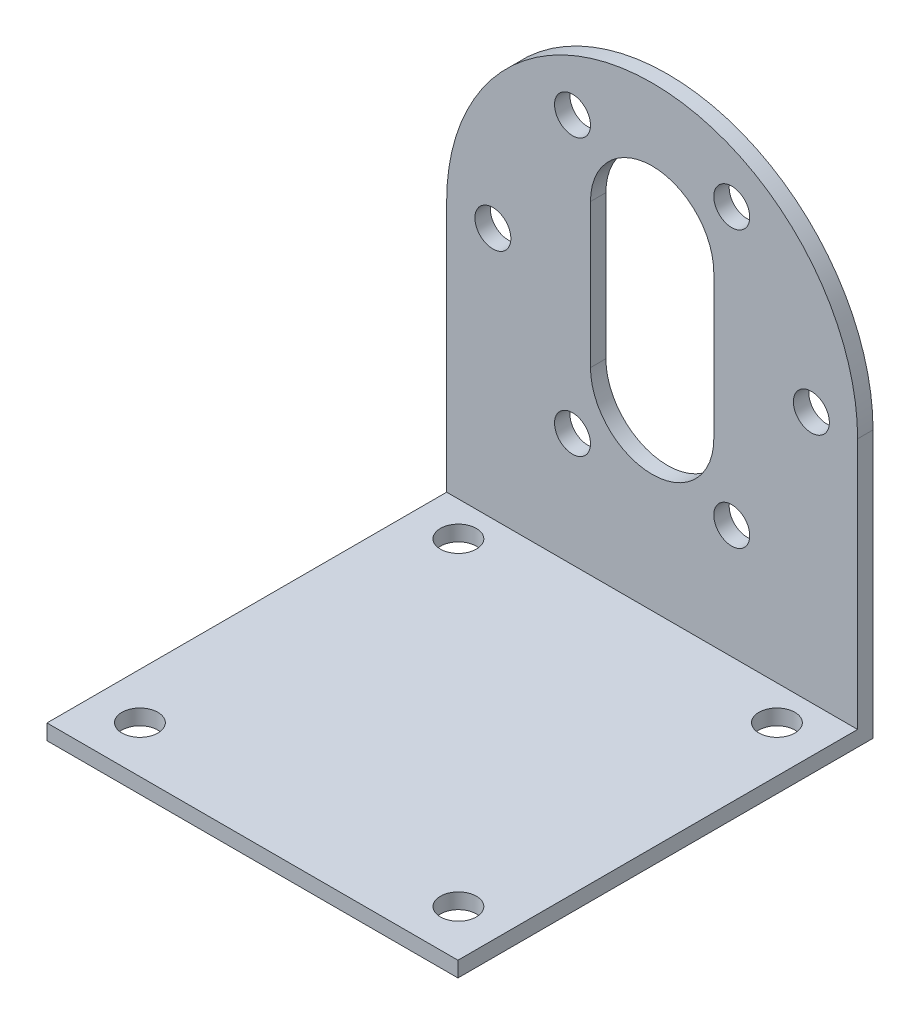
ISO-10303-21;
HEADER;
FILE_DESCRIPTION(('STEP AP214'),'2;1');
FILE_NAME('part.step','',(''),(''),'','','');
FILE_SCHEMA(('AUTOMOTIVE_DESIGN { 1 0 10303 214 1 1 1 1 }'));
ENDSEC;
DATA;
#1=APPLICATION_CONTEXT('core data for automotive mechanical design processes');
#2=APPLICATION_PROTOCOL_DEFINITION('international standard','automotive_design',2000,#1);
#3=PRODUCT_CONTEXT('',#1,'mechanical');
#4=PRODUCT('Part','Part','',(#3));
#5=PRODUCT_RELATED_PRODUCT_CATEGORY('part','',(#4));
#6=PRODUCT_DEFINITION_FORMATION('','',#4);
#7=PRODUCT_DEFINITION_CONTEXT('part definition',#1,'design');
#8=PRODUCT_DEFINITION('design','',#6,#7);
#9=PRODUCT_DEFINITION_SHAPE('','',#8);
#10=(LENGTH_UNIT() NAMED_UNIT(*) SI_UNIT(.MILLI.,.METRE.));
#11=(NAMED_UNIT(*) PLANE_ANGLE_UNIT() SI_UNIT($,.RADIAN.));
#12=(NAMED_UNIT(*) SI_UNIT($,.STERADIAN.) SOLID_ANGLE_UNIT());
#13=UNCERTAINTY_MEASURE_WITH_UNIT(LENGTH_MEASURE(1.E-05),#10,'distance_accuracy_value','');
#14=(GEOMETRIC_REPRESENTATION_CONTEXT(3) GLOBAL_UNCERTAINTY_ASSIGNED_CONTEXT((#13)) GLOBAL_UNIT_ASSIGNED_CONTEXT((#10,
#11,#12)) REPRESENTATION_CONTEXT('',''));
#15=CARTESIAN_POINT('',(0.,0.,0.));
#16=DIRECTION('',(0.,0.,1.));
#17=DIRECTION('',(1.,0.,0.));
#18=AXIS2_PLACEMENT_3D('',#15,#16,#17);
#19=CARTESIAN_POINT('',(20.,33.,1.5));
#20=DIRECTION('',(0.,0.,-1.));
#21=DIRECTION('',(-1.,0.,0.));
#22=AXIS2_PLACEMENT_3D('',#19,#20,#21);
#23=CYLINDRICAL_SURFACE('',#22,6.00000000000001);
#24=CARTESIAN_POINT('',(20.,33.,0.));
#25=DIRECTION('',(0.,0.,1.));
#26=DIRECTION('',(1.,0.,0.));
#27=AXIS2_PLACEMENT_3D('',#24,#25,#26);
#28=CIRCLE('',#27,6.00000000000001);
#29=CARTESIAN_POINT('',(26.,33.,0.));
#30=VERTEX_POINT('',#29);
#31=CARTESIAN_POINT('',(14.,33.,0.));
#32=VERTEX_POINT('',#31);
#33=EDGE_CURVE('E192',#30,#32,#28,.T.);
#34=ORIENTED_EDGE('',*,*,#33,.F.);
#35=DIRECTION('',(0.,0.,-1.));
#36=VECTOR('',#35,1.);
#37=CARTESIAN_POINT('',(26.,33.,1.5));
#38=LINE('',#37,#36);
#39=CARTESIAN_POINT('',(26.,33.,1.5));
#40=VERTEX_POINT('',#39);
#41=EDGE_CURVE('E11',#40,#30,#38,.T.);
#42=ORIENTED_EDGE('',*,*,#41,.F.);
#43=CARTESIAN_POINT('',(20.,33.,1.5));
#44=DIRECTION('',(0.,0.,1.));
#45=DIRECTION('',(1.,0.,0.));
#46=AXIS2_PLACEMENT_3D('',#43,#44,#45);
#47=CIRCLE('',#46,6.00000000000001);
#48=CARTESIAN_POINT('',(14.,33.,1.5));
#49=VERTEX_POINT('',#48);
#50=EDGE_CURVE('E154',#40,#49,#47,.T.);
#51=ORIENTED_EDGE('',*,*,#50,.T.);
#52=DIRECTION('',(0.,0.,-1.));
#53=VECTOR('',#52,1.);
#54=CARTESIAN_POINT('',(14.,33.,1.5));
#55=LINE('',#54,#53);
#56=EDGE_CURVE('E215',#49,#32,#55,.T.);
#57=ORIENTED_EDGE('',*,*,#56,.T.);
#58=EDGE_LOOP('',(#34,#42,#51,#57));
#59=FACE_BOUND('',#58,.T.);
#60=ADVANCED_FACE('F34',(#59),#23,.F.);
#61=CARTESIAN_POINT('',(26.,0.,1.5));
#62=DIRECTION('',(-1.,0.,0.));
#63=DIRECTION('',(0.,0.,1.));
#64=AXIS2_PLACEMENT_3D('',#61,#62,#63);
#65=PLANE('',#64);
#66=DIRECTION('',(0.,1.,0.));
#67=VECTOR('',#66,1.);
#68=CARTESIAN_POINT('',(26.,0.,0.));
#69=LINE('',#68,#67);
#70=CARTESIAN_POINT('',(26.,19.,0.));
#71=VERTEX_POINT('',#70);
#72=EDGE_CURVE('E195',#71,#30,#69,.T.);
#73=ORIENTED_EDGE('',*,*,#72,.F.);
#74=DIRECTION('',(0.,0.,-1.));
#75=VECTOR('',#74,1.);
#76=CARTESIAN_POINT('',(26.,19.,1.5));
#77=LINE('',#76,#75);
#78=CARTESIAN_POINT('',(26.,19.,1.5));
#79=VERTEX_POINT('',#78);
#80=EDGE_CURVE('E43',#79,#71,#77,.T.);
#81=ORIENTED_EDGE('',*,*,#80,.F.);
#82=DIRECTION('',(0.,1.,0.));
#83=VECTOR('',#82,1.);
#84=CARTESIAN_POINT('',(26.,0.,1.5));
#85=LINE('',#84,#83);
#86=EDGE_CURVE('E157',#79,#40,#85,.T.);
#87=ORIENTED_EDGE('',*,*,#86,.T.);
#88=ORIENTED_EDGE('',*,*,#41,.T.);
#89=EDGE_LOOP('',(#73,#81,#87,#88));
#90=FACE_BOUND('',#89,.T.);
#91=ADVANCED_FACE('F299',(#90),#65,.T.);
#92=CARTESIAN_POINT('',(20.,19.,1.5));
#93=DIRECTION('',(0.,0.,-1.));
#94=DIRECTION('',(-1.,0.,0.));
#95=AXIS2_PLACEMENT_3D('',#92,#93,#94);
#96=CYLINDRICAL_SURFACE('',#95,6.00000000000001);
#97=CARTESIAN_POINT('',(20.,19.,0.));
#98=DIRECTION('',(0.,0.,1.));
#99=DIRECTION('',(1.,0.,0.));
#100=AXIS2_PLACEMENT_3D('',#97,#98,#99);
#101=CIRCLE('',#100,6.00000000000001);
#102=CARTESIAN_POINT('',(14.,19.,0.));
#103=VERTEX_POINT('',#102);
#104=EDGE_CURVE('E198',#103,#71,#101,.T.);
#105=ORIENTED_EDGE('',*,*,#104,.F.);
#106=DIRECTION('',(0.,0.,-1.));
#107=VECTOR('',#106,1.);
#108=CARTESIAN_POINT('',(14.,19.,1.5));
#109=LINE('',#108,#107);
#110=CARTESIAN_POINT('',(14.,19.,1.5));
#111=VERTEX_POINT('',#110);
#112=EDGE_CURVE('E217',#111,#103,#109,.T.);
#113=ORIENTED_EDGE('',*,*,#112,.F.);
#114=CARTESIAN_POINT('',(20.,19.,1.5));
#115=DIRECTION('',(0.,0.,1.));
#116=DIRECTION('',(1.,0.,0.));
#117=AXIS2_PLACEMENT_3D('',#114,#115,#116);
#118=CIRCLE('',#117,6.00000000000001);
#119=EDGE_CURVE('E160',#111,#79,#118,.T.);
#120=ORIENTED_EDGE('',*,*,#119,.T.);
#121=ORIENTED_EDGE('',*,*,#80,.T.);
#122=EDGE_LOOP('',(#105,#113,#120,#121));
#123=FACE_BOUND('',#122,.T.);
#124=ADVANCED_FACE('F305',(#123),#96,.F.);
#125=CARTESIAN_POINT('',(40.,0.,1.5));
#126=DIRECTION('',(-1.,0.,0.));
#127=DIRECTION('',(0.,0.,1.));
#128=AXIS2_PLACEMENT_3D('',#125,#126,#127);
#129=PLANE('',#128);
#130=DIRECTION('',(0.,1.,0.));
#131=VECTOR('',#130,1.);
#132=CARTESIAN_POINT('',(40.,0.,1.5));
#133=LINE('',#132,#131);
#134=CARTESIAN_POINT('',(40.,1.5,1.5));
#135=VERTEX_POINT('',#134);
#136=CARTESIAN_POINT('',(40.,26.,1.5));
#137=VERTEX_POINT('',#136);
#138=EDGE_CURVE('E117',#135,#137,#133,.T.);
#139=ORIENTED_EDGE('',*,*,#138,.F.);
#140=DIRECTION('',(0.,0.,1.));
#141=VECTOR('',#140,1.);
#142=CARTESIAN_POINT('',(40.,1.5,0.));
#143=LINE('',#142,#141);
#144=CARTESIAN_POINT('',(40.,1.5,40.4));
#145=VERTEX_POINT('',#144);
#146=EDGE_CURVE('E110',#135,#145,#143,.T.);
#147=ORIENTED_EDGE('',*,*,#146,.T.);
#148=DIRECTION('',(0.,-1.,0.));
#149=VECTOR('',#148,1.);
#150=CARTESIAN_POINT('',(40.,1.5,40.4));
#151=LINE('',#150,#149);
#152=CARTESIAN_POINT('',(40.,0.,40.4));
#153=VERTEX_POINT('',#152);
#154=EDGE_CURVE('E114',#145,#153,#151,.T.);
#155=ORIENTED_EDGE('',*,*,#154,.T.);
#156=DIRECTION('',(0.,0.,-1.));
#157=VECTOR('',#156,1.);
#158=CARTESIAN_POINT('',(40.,0.,1.5));
#159=LINE('',#158,#157);
#160=CARTESIAN_POINT('',(40.,0.,0.));
#161=VERTEX_POINT('',#160);
#162=EDGE_CURVE('E177',#153,#161,#159,.T.);
#163=ORIENTED_EDGE('',*,*,#162,.T.);
#164=DIRECTION('',(0.,1.,0.));
#165=VECTOR('',#164,1.);
#166=CARTESIAN_POINT('',(40.,0.,0.));
#167=LINE('',#166,#165);
#168=CARTESIAN_POINT('',(40.,26.,0.));
#169=VERTEX_POINT('',#168);
#170=EDGE_CURVE('E180',#161,#169,#167,.T.);
#171=ORIENTED_EDGE('',*,*,#170,.T.);
#172=DIRECTION('',(0.,0.,-1.));
#173=VECTOR('',#172,1.);
#174=CARTESIAN_POINT('',(40.,26.,1.5));
#175=LINE('',#174,#173);
#176=EDGE_CURVE('E38',#137,#169,#175,.T.);
#177=ORIENTED_EDGE('',*,*,#176,.F.);
#178=EDGE_LOOP('',(#139,#147,#155,#163,#171,#177));
#179=FACE_BOUND('',#178,.T.);
#180=ADVANCED_FACE('F112',(#179),#129,.F.);
#181=CARTESIAN_POINT('',(20.,26.,1.5));
#182=DIRECTION('',(0.,0.,-1.));
#183=DIRECTION('',(-1.,0.,0.));
#184=AXIS2_PLACEMENT_3D('',#181,#182,#183);
#185=CYLINDRICAL_SURFACE('',#184,20.);
#186=CARTESIAN_POINT('',(20.,26.,0.));
#187=DIRECTION('',(0.,0.,1.));
#188=DIRECTION('',(1.,0.,0.));
#189=AXIS2_PLACEMENT_3D('',#186,#187,#188);
#190=CIRCLE('',#189,20.);
#191=CARTESIAN_POINT('',(0.,26.,0.));
#192=VERTEX_POINT('',#191);
#193=EDGE_CURVE('E182',#192,#169,#190,.F.);
#194=ORIENTED_EDGE('',*,*,#193,.F.);
#195=DIRECTION('',(0.,0.,-1.));
#196=VECTOR('',#195,1.);
#197=CARTESIAN_POINT('',(0.,26.,1.5));
#198=LINE('',#197,#196);
#199=CARTESIAN_POINT('',(0.,26.,1.5));
#200=VERTEX_POINT('',#199);
#201=EDGE_CURVE('E222',#200,#192,#198,.T.);
#202=ORIENTED_EDGE('',*,*,#201,.F.);
#203=CARTESIAN_POINT('',(20.,26.,1.5));
#204=DIRECTION('',(0.,0.,1.));
#205=DIRECTION('',(1.,0.,0.));
#206=AXIS2_PLACEMENT_3D('',#203,#204,#205);
#207=CIRCLE('',#206,20.);
#208=EDGE_CURVE('E147',#200,#137,#207,.F.);
#209=ORIENTED_EDGE('',*,*,#208,.T.);
#210=ORIENTED_EDGE('',*,*,#176,.T.);
#211=EDGE_LOOP('',(#194,#202,#209,#210));
#212=FACE_BOUND('',#211,.T.);
#213=ADVANCED_FACE('F230',(#212),#185,.T.);
#214=CARTESIAN_POINT('',(0.,0.,1.5));
#215=DIRECTION('',(-1.,0.,0.));
#216=DIRECTION('',(0.,0.,1.));
#217=AXIS2_PLACEMENT_3D('',#214,#215,#216);
#218=PLANE('',#217);
#219=ORIENTED_EDGE('',*,*,#201,.T.);
#220=DIRECTION('',(0.,1.,0.));
#221=VECTOR('',#220,1.);
#222=CARTESIAN_POINT('',(0.,0.,0.));
#223=LINE('',#222,#221);
#224=CARTESIAN_POINT('',(0.,0.,0.));
#225=VERTEX_POINT('',#224);
#226=EDGE_CURVE('E185',#225,#192,#223,.T.);
#227=ORIENTED_EDGE('',*,*,#226,.F.);
#228=DIRECTION('',(0.,0.,-1.));
#229=VECTOR('',#228,1.);
#230=CARTESIAN_POINT('',(0.,0.,1.5));
#231=LINE('',#230,#229);
#232=CARTESIAN_POINT('',(0.,0.,40.4));
#233=VERTEX_POINT('',#232);
#234=EDGE_CURVE('E221',#233,#225,#231,.T.);
#235=ORIENTED_EDGE('',*,*,#234,.F.);
#236=DIRECTION('',(0.,-1.,0.));
#237=VECTOR('',#236,1.);
#238=CARTESIAN_POINT('',(0.,1.5,40.4));
#239=LINE('',#238,#237);
#240=CARTESIAN_POINT('',(0.,1.5,40.4));
#241=VERTEX_POINT('',#240);
#242=EDGE_CURVE('E129',#241,#233,#239,.T.);
#243=ORIENTED_EDGE('',*,*,#242,.F.);
#244=DIRECTION('',(0.,0.,-1.));
#245=VECTOR('',#244,1.);
#246=CARTESIAN_POINT('',(0.,1.5,0.));
#247=LINE('',#246,#245);
#248=CARTESIAN_POINT('',(0.,1.5,1.5));
#249=VERTEX_POINT('',#248);
#250=EDGE_CURVE('E121',#241,#249,#247,.T.);
#251=ORIENTED_EDGE('',*,*,#250,.T.);
#252=DIRECTION('',(0.,1.,0.));
#253=VECTOR('',#252,1.);
#254=CARTESIAN_POINT('',(0.,0.,1.5));
#255=LINE('',#254,#253);
#256=EDGE_CURVE('E51',#249,#200,#255,.T.);
#257=ORIENTED_EDGE('',*,*,#256,.T.);
#258=EDGE_LOOP('',(#219,#227,#235,#243,#251,#257));
#259=FACE_BOUND('',#258,.T.);
#260=ADVANCED_FACE('F236',(#259),#218,.T.);
#261=CARTESIAN_POINT('',(27.7500000000002,39.4233937586587,1.5));
#262=DIRECTION('',(0.,0.,-1.));
#263=DIRECTION('',(-1.,0.,0.));
#264=AXIS2_PLACEMENT_3D('',#261,#262,#263);
#265=CYLINDRICAL_SURFACE('',#264,1.75);
#266=CARTESIAN_POINT('',(27.7500000000002,39.4233937586587,1.5));
#267=DIRECTION('',(0.,0.,1.));
#268=DIRECTION('',(1.,0.,0.));
#269=AXIS2_PLACEMENT_3D('',#266,#267,#268);
#270=CIRCLE('',#269,1.75);
#271=CARTESIAN_POINT('',(29.5000000000002,39.4233937586587,1.5));
#272=VERTEX_POINT('',#271);
#273=EDGE_CURVE('E171',#272,#272,#270,.T.);
#274=ORIENTED_EDGE('',*,*,#273,.T.);
#275=EDGE_LOOP('',(#274));
#276=FACE_BOUND('',#275,.T.);
#277=CARTESIAN_POINT('',(27.7500000000002,39.4233937586587,0.));
#278=DIRECTION('',(0.,0.,1.));
#279=DIRECTION('',(1.,0.,0.));
#280=AXIS2_PLACEMENT_3D('',#277,#278,#279);
#281=CIRCLE('',#280,1.75);
#282=CARTESIAN_POINT('',(29.5000000000002,39.4233937586587,0.));
#283=VERTEX_POINT('',#282);
#284=EDGE_CURVE('E210',#283,#283,#281,.T.);
#285=ORIENTED_EDGE('',*,*,#284,.F.);
#286=EDGE_LOOP('',(#285));
#287=FACE_BOUND('',#286,.T.);
#288=ADVANCED_FACE('F317',(#276,#287),#265,.F.);
#289=CARTESIAN_POINT('',(27.75,12.5766062413412,1.5));
#290=DIRECTION('',(0.,0.,-1.));
#291=DIRECTION('',(-1.,0.,0.));
#292=AXIS2_PLACEMENT_3D('',#289,#290,#291);
#293=CYLINDRICAL_SURFACE('',#292,1.75000000000001);
#294=CARTESIAN_POINT('',(27.75,12.5766062413412,1.5));
#295=DIRECTION('',(0.,0.,1.));
#296=DIRECTION('',(1.,0.,0.));
#297=AXIS2_PLACEMENT_3D('',#294,#295,#296);
#298=CIRCLE('',#297,1.75000000000001);
#299=CARTESIAN_POINT('',(29.5,12.5766062413412,1.5));
#300=VERTEX_POINT('',#299);
#301=EDGE_CURVE('E168',#300,#300,#298,.T.);
#302=ORIENTED_EDGE('',*,*,#301,.T.);
#303=EDGE_LOOP('',(#302));
#304=FACE_BOUND('',#303,.T.);
#305=CARTESIAN_POINT('',(27.75,12.5766062413412,0.));
#306=DIRECTION('',(0.,0.,1.));
#307=DIRECTION('',(1.,0.,0.));
#308=AXIS2_PLACEMENT_3D('',#305,#306,#307);
#309=CIRCLE('',#308,1.75000000000001);
#310=CARTESIAN_POINT('',(29.5,12.5766062413412,0.));
#311=VERTEX_POINT('',#310);
#312=EDGE_CURVE('E207',#311,#311,#309,.T.);
#313=ORIENTED_EDGE('',*,*,#312,.F.);
#314=EDGE_LOOP('',(#313));
#315=FACE_BOUND('',#314,.T.);
#316=ADVANCED_FACE('F334',(#304,#315),#293,.F.);
#317=CARTESIAN_POINT('',(12.2499999999999,12.5766062413412,1.5));
#318=DIRECTION('',(0.,0.,-1.));
#319=DIRECTION('',(-1.,0.,0.));
#320=AXIS2_PLACEMENT_3D('',#317,#318,#319);
#321=CYLINDRICAL_SURFACE('',#320,1.75);
#322=CARTESIAN_POINT('',(12.2499999999999,12.5766062413412,1.5));
#323=DIRECTION('',(0.,0.,1.));
#324=DIRECTION('',(1.,0.,0.));
#325=AXIS2_PLACEMENT_3D('',#322,#323,#324);
#326=CIRCLE('',#325,1.75);
#327=CARTESIAN_POINT('',(13.9999999999999,12.5766062413412,1.5));
#328=VERTEX_POINT('',#327);
#329=EDGE_CURVE('E165',#328,#328,#326,.T.);
#330=ORIENTED_EDGE('',*,*,#329,.T.);
#331=EDGE_LOOP('',(#330));
#332=FACE_BOUND('',#331,.T.);
#333=CARTESIAN_POINT('',(12.2499999999999,12.5766062413412,0.));
#334=DIRECTION('',(0.,0.,1.));
#335=DIRECTION('',(1.,0.,0.));
#336=AXIS2_PLACEMENT_3D('',#333,#334,#335);
#337=CIRCLE('',#336,1.75);
#338=CARTESIAN_POINT('',(13.9999999999999,12.5766062413412,0.));
#339=VERTEX_POINT('',#338);
#340=EDGE_CURVE('E204',#339,#339,#337,.T.);
#341=ORIENTED_EDGE('',*,*,#340,.F.);
#342=EDGE_LOOP('',(#341));
#343=FACE_BOUND('',#342,.T.);
#344=ADVANCED_FACE('F330',(#332,#343),#321,.F.);
#345=CARTESIAN_POINT('',(14.,0.,1.5));
#346=DIRECTION('',(-1.,0.,0.));
#347=DIRECTION('',(0.,0.,1.));
#348=AXIS2_PLACEMENT_3D('',#345,#346,#347);
#349=PLANE('',#348);
#350=DIRECTION('',(0.,1.,0.));
#351=VECTOR('',#350,1.);
#352=CARTESIAN_POINT('',(14.,0.,0.));
#353=LINE('',#352,#351);
#354=EDGE_CURVE('E201',#103,#32,#353,.T.);
#355=ORIENTED_EDGE('',*,*,#354,.T.);
#356=ORIENTED_EDGE('',*,*,#56,.F.);
#357=DIRECTION('',(0.,1.,0.));
#358=VECTOR('',#357,1.);
#359=CARTESIAN_POINT('',(14.,0.,1.5));
#360=LINE('',#359,#358);
#361=EDGE_CURVE('E163',#111,#49,#360,.T.);
#362=ORIENTED_EDGE('',*,*,#361,.F.);
#363=ORIENTED_EDGE('',*,*,#112,.T.);
#364=EDGE_LOOP('',(#355,#356,#362,#363));
#365=FACE_BOUND('',#364,.T.);
#366=ADVANCED_FACE('F312',(#365),#349,.F.);
#367=CARTESIAN_POINT('',(35.5,26.,1.5));
#368=DIRECTION('',(0.,0.,-1.));
#369=DIRECTION('',(-1.,0.,0.));
#370=AXIS2_PLACEMENT_3D('',#367,#368,#369);
#371=CYLINDRICAL_SURFACE('',#370,1.75);
#372=CARTESIAN_POINT('',(35.5,26.,1.5));
#373=DIRECTION('',(0.,0.,1.));
#374=DIRECTION('',(1.,0.,0.));
#375=AXIS2_PLACEMENT_3D('',#372,#373,#374);
#376=CIRCLE('',#375,1.75);
#377=CARTESIAN_POINT('',(37.25,26.,1.5));
#378=VERTEX_POINT('',#377);
#379=EDGE_CURVE('E151',#378,#378,#376,.T.);
#380=ORIENTED_EDGE('',*,*,#379,.T.);
#381=EDGE_LOOP('',(#380));
#382=FACE_BOUND('',#381,.T.);
#383=CARTESIAN_POINT('',(35.5,26.,0.));
#384=DIRECTION('',(0.,0.,1.));
#385=DIRECTION('',(1.,0.,0.));
#386=AXIS2_PLACEMENT_3D('',#383,#384,#385);
#387=CIRCLE('',#386,1.75);
#388=CARTESIAN_POINT('',(37.25,26.,0.));
#389=VERTEX_POINT('',#388);
#390=EDGE_CURVE('E189',#389,#389,#387,.T.);
#391=ORIENTED_EDGE('',*,*,#390,.F.);
#392=EDGE_LOOP('',(#391));
#393=FACE_BOUND('',#392,.T.);
#394=ADVANCED_FACE('F241',(#382,#393),#371,.F.);
#395=CARTESIAN_POINT('',(0.,0.,1.5));
#396=DIRECTION('',(0.,1.,0.));
#397=DIRECTION('',(0.,0.,1.));
#398=AXIS2_PLACEMENT_3D('',#395,#396,#397);
#399=PLANE('',#398);
#400=DIRECTION('',(1.,0.,0.));
#401=VECTOR('',#400,1.);
#402=CARTESIAN_POINT('',(0.,0.,0.));
#403=LINE('',#402,#401);
#404=EDGE_CURVE('E187',#225,#161,#403,.T.);
#405=ORIENTED_EDGE('',*,*,#404,.T.);
#406=ORIENTED_EDGE('',*,*,#162,.F.);
#407=DIRECTION('',(-1.,0.,0.));
#408=VECTOR('',#407,1.);
#409=CARTESIAN_POINT('',(0.,0.,40.4));
#410=LINE('',#409,#408);
#411=EDGE_CURVE('E128',#153,#233,#410,.T.);
#412=ORIENTED_EDGE('',*,*,#411,.T.);
#413=ORIENTED_EDGE('',*,*,#234,.T.);
#414=EDGE_LOOP('',(#405,#406,#412,#413));
#415=FACE_BOUND('',#414,.T.);
#416=CARTESIAN_POINT('',(4.49999999999999,0.,4.855));
#417=DIRECTION('',(0.,-1.,0.));
#418=DIRECTION('',(0.,0.,-1.));
#419=AXIS2_PLACEMENT_3D('',#416,#417,#418);
#420=CIRCLE('',#419,1.75);
#421=CARTESIAN_POINT('',(4.49999999999999,0.,3.10500000000001));
#422=VERTEX_POINT('',#421);
#423=EDGE_CURVE('E246',#422,#422,#420,.T.);
#424=ORIENTED_EDGE('',*,*,#423,.F.);
#425=EDGE_LOOP('',(#424));
#426=FACE_BOUND('',#425,.T.);
#427=CARTESIAN_POINT('',(35.5,0.,4.855));
#428=DIRECTION('',(0.,-1.,0.));
#429=DIRECTION('',(0.,0.,-1.));
#430=AXIS2_PLACEMENT_3D('',#427,#428,#429);
#431=CIRCLE('',#430,1.75);
#432=CARTESIAN_POINT('',(35.5,0.,3.105));
#433=VERTEX_POINT('',#432);
#434=EDGE_CURVE('E250',#433,#433,#431,.T.);
#435=ORIENTED_EDGE('',*,*,#434,.F.);
#436=EDGE_LOOP('',(#435));
#437=FACE_BOUND('',#436,.T.);
#438=CARTESIAN_POINT('',(35.5,0.,35.855));
#439=DIRECTION('',(0.,-1.,0.));
#440=DIRECTION('',(0.,0.,-1.));
#441=AXIS2_PLACEMENT_3D('',#438,#439,#440);
#442=CIRCLE('',#441,1.75);
#443=CARTESIAN_POINT('',(35.5,0.,34.105));
#444=VERTEX_POINT('',#443);
#445=EDGE_CURVE('E254',#444,#444,#442,.T.);
#446=ORIENTED_EDGE('',*,*,#445,.F.);
#447=EDGE_LOOP('',(#446));
#448=FACE_BOUND('',#447,.T.);
#449=CARTESIAN_POINT('',(4.49999999999999,0.,35.855));
#450=DIRECTION('',(0.,-1.,0.));
#451=DIRECTION('',(0.,0.,-1.));
#452=AXIS2_PLACEMENT_3D('',#449,#450,#451);
#453=CIRCLE('',#452,1.75);
#454=CARTESIAN_POINT('',(4.49999999999999,0.,34.105));
#455=VERTEX_POINT('',#454);
#456=EDGE_CURVE('E257',#455,#455,#453,.T.);
#457=ORIENTED_EDGE('',*,*,#456,.F.);
#458=EDGE_LOOP('',(#457));
#459=FACE_BOUND('',#458,.T.);
#460=ADVANCED_FACE('F238',(#415,#426,#437,#448,#459),#399,.F.);
#461=CARTESIAN_POINT('',(4.5,26.0000000000001,1.5));
#462=DIRECTION('',(0.,0.,-1.));
#463=DIRECTION('',(-1.,0.,0.));
#464=AXIS2_PLACEMENT_3D('',#461,#462,#463);
#465=CYLINDRICAL_SURFACE('',#464,1.75000000000001);
#466=CARTESIAN_POINT('',(4.5,26.0000000000001,1.5));
#467=DIRECTION('',(0.,0.,1.));
#468=DIRECTION('',(1.,0.,0.));
#469=AXIS2_PLACEMENT_3D('',#466,#467,#468);
#470=CIRCLE('',#469,1.75000000000001);
#471=CARTESIAN_POINT('',(6.25,26.0000000000001,1.5));
#472=VERTEX_POINT('',#471);
#473=EDGE_CURVE('E142',#472,#472,#470,.T.);
#474=ORIENTED_EDGE('',*,*,#473,.T.);
#475=EDGE_LOOP('',(#474));
#476=FACE_BOUND('',#475,.T.);
#477=CARTESIAN_POINT('',(4.5,26.0000000000001,0.));
#478=DIRECTION('',(0.,0.,1.));
#479=DIRECTION('',(1.,0.,0.));
#480=AXIS2_PLACEMENT_3D('',#477,#478,#479);
#481=CIRCLE('',#480,1.75000000000001);
#482=CARTESIAN_POINT('',(6.25,26.0000000000001,0.));
#483=VERTEX_POINT('',#482);
#484=EDGE_CURVE('E141',#483,#483,#481,.T.);
#485=ORIENTED_EDGE('',*,*,#484,.F.);
#486=EDGE_LOOP('',(#485));
#487=FACE_BOUND('',#486,.T.);
#488=ADVANCED_FACE('F36',(#476,#487),#465,.F.);
#489=CARTESIAN_POINT('',(12.2500000000001,39.4233937586589,1.5));
#490=DIRECTION('',(0.,0.,-1.));
#491=DIRECTION('',(-1.,0.,0.));
#492=AXIS2_PLACEMENT_3D('',#489,#490,#491);
#493=CYLINDRICAL_SURFACE('',#492,1.75000000000001);
#494=CARTESIAN_POINT('',(12.2500000000001,39.4233937586589,1.5));
#495=DIRECTION('',(0.,0.,1.));
#496=DIRECTION('',(1.,0.,0.));
#497=AXIS2_PLACEMENT_3D('',#494,#495,#496);
#498=CIRCLE('',#497,1.75000000000001);
#499=CARTESIAN_POINT('',(14.0000000000001,39.4233937586589,1.5));
#500=VERTEX_POINT('',#499);
#501=EDGE_CURVE('E174',#500,#500,#498,.T.);
#502=ORIENTED_EDGE('',*,*,#501,.T.);
#503=EDGE_LOOP('',(#502));
#504=FACE_BOUND('',#503,.T.);
#505=CARTESIAN_POINT('',(12.2500000000001,39.4233937586589,0.));
#506=DIRECTION('',(0.,0.,1.));
#507=DIRECTION('',(1.,0.,0.));
#508=AXIS2_PLACEMENT_3D('',#505,#506,#507);
#509=CIRCLE('',#508,1.75000000000001);
#510=CARTESIAN_POINT('',(14.0000000000001,39.4233937586589,0.));
#511=VERTEX_POINT('',#510);
#512=EDGE_CURVE('E145',#511,#511,#509,.T.);
#513=ORIENTED_EDGE('',*,*,#512,.F.);
#514=EDGE_LOOP('',(#513));
#515=FACE_BOUND('',#514,.T.);
#516=ADVANCED_FACE('F269',(#504,#515),#493,.F.);
#517=CARTESIAN_POINT('',(0.,0.,1.5));
#518=DIRECTION('',(0.,0.,1.));
#519=DIRECTION('',(1.,0.,0.));
#520=AXIS2_PLACEMENT_3D('',#517,#518,#519);
#521=PLANE('',#520);
#522=DIRECTION('',(-1.,0.,0.));
#523=VECTOR('',#522,1.);
#524=CARTESIAN_POINT('',(0.,1.5,1.5));
#525=LINE('',#524,#523);
#526=EDGE_CURVE('E55',#135,#249,#525,.T.);
#527=ORIENTED_EDGE('',*,*,#526,.F.);
#528=ORIENTED_EDGE('',*,*,#138,.T.);
#529=ORIENTED_EDGE('',*,*,#208,.F.);
#530=ORIENTED_EDGE('',*,*,#256,.F.);
#531=EDGE_LOOP('',(#527,#528,#529,#530));
#532=FACE_BOUND('',#531,.T.);
#533=ORIENTED_EDGE('',*,*,#473,.F.);
#534=EDGE_LOOP('',(#533));
#535=FACE_BOUND('',#534,.T.);
#536=ORIENTED_EDGE('',*,*,#379,.F.);
#537=EDGE_LOOP('',(#536));
#538=FACE_BOUND('',#537,.T.);
#539=ORIENTED_EDGE('',*,*,#50,.F.);
#540=ORIENTED_EDGE('',*,*,#86,.F.);
#541=ORIENTED_EDGE('',*,*,#119,.F.);
#542=ORIENTED_EDGE('',*,*,#361,.T.);
#543=EDGE_LOOP('',(#539,#540,#541,#542));
#544=FACE_BOUND('',#543,.T.);
#545=ORIENTED_EDGE('',*,*,#329,.F.);
#546=EDGE_LOOP('',(#545));
#547=FACE_BOUND('',#546,.T.);
#548=ORIENTED_EDGE('',*,*,#301,.F.);
#549=EDGE_LOOP('',(#548));
#550=FACE_BOUND('',#549,.T.);
#551=ORIENTED_EDGE('',*,*,#273,.F.);
#552=EDGE_LOOP('',(#551));
#553=FACE_BOUND('',#552,.T.);
#554=ORIENTED_EDGE('',*,*,#501,.F.);
#555=EDGE_LOOP('',(#554));
#556=FACE_BOUND('',#555,.T.);
#557=ADVANCED_FACE('F266',(#532,#535,#538,#544,#547,#550,#553,#556),#521,.T.);
#558=CARTESIAN_POINT('',(0.,0.,0.));
#559=DIRECTION('',(0.,0.,1.));
#560=DIRECTION('',(1.,0.,0.));
#561=AXIS2_PLACEMENT_3D('',#558,#559,#560);
#562=PLANE('',#561);
#563=ORIENTED_EDGE('',*,*,#484,.T.);
#564=EDGE_LOOP('',(#563));
#565=FACE_BOUND('',#564,.T.);
#566=ORIENTED_EDGE('',*,*,#193,.T.);
#567=ORIENTED_EDGE('',*,*,#170,.F.);
#568=ORIENTED_EDGE('',*,*,#404,.F.);
#569=ORIENTED_EDGE('',*,*,#226,.T.);
#570=EDGE_LOOP('',(#566,#567,#568,#569));
#571=FACE_BOUND('',#570,.T.);
#572=ORIENTED_EDGE('',*,*,#390,.T.);
#573=EDGE_LOOP('',(#572));
#574=FACE_BOUND('',#573,.T.);
#575=ORIENTED_EDGE('',*,*,#33,.T.);
#576=ORIENTED_EDGE('',*,*,#354,.F.);
#577=ORIENTED_EDGE('',*,*,#104,.T.);
#578=ORIENTED_EDGE('',*,*,#72,.T.);
#579=EDGE_LOOP('',(#575,#576,#577,#578));
#580=FACE_BOUND('',#579,.T.);
#581=ORIENTED_EDGE('',*,*,#340,.T.);
#582=EDGE_LOOP('',(#581));
#583=FACE_BOUND('',#582,.T.);
#584=ORIENTED_EDGE('',*,*,#312,.T.);
#585=EDGE_LOOP('',(#584));
#586=FACE_BOUND('',#585,.T.);
#587=ORIENTED_EDGE('',*,*,#284,.T.);
#588=EDGE_LOOP('',(#587));
#589=FACE_BOUND('',#588,.T.);
#590=ORIENTED_EDGE('',*,*,#512,.T.);
#591=EDGE_LOOP('',(#590));
#592=FACE_BOUND('',#591,.T.);
#593=ADVANCED_FACE('F233',(#565,#571,#574,#580,#583,#586,#589,#592),#562,.F.);
#594=CARTESIAN_POINT('',(0.,1.5,40.4));
#595=DIRECTION('',(0.,0.,1.));
#596=DIRECTION('',(1.,0.,0.));
#597=AXIS2_PLACEMENT_3D('',#594,#595,#596);
#598=PLANE('',#597);
#599=ORIENTED_EDGE('',*,*,#411,.F.);
#600=ORIENTED_EDGE('',*,*,#154,.F.);
#601=DIRECTION('',(-1.,0.,0.));
#602=VECTOR('',#601,1.);
#603=CARTESIAN_POINT('',(0.,1.5,40.4));
#604=LINE('',#603,#602);
#605=EDGE_CURVE('E120',#145,#241,#604,.T.);
#606=ORIENTED_EDGE('',*,*,#605,.T.);
#607=ORIENTED_EDGE('',*,*,#242,.T.);
#608=EDGE_LOOP('',(#599,#600,#606,#607));
#609=FACE_BOUND('',#608,.T.);
#610=ADVANCED_FACE('F125',(#609),#598,.T.);
#611=CARTESIAN_POINT('',(0.,1.5,0.));
#612=DIRECTION('',(0.,1.,0.));
#613=DIRECTION('',(0.,0.,1.));
#614=AXIS2_PLACEMENT_3D('',#611,#612,#613);
#615=PLANE('',#614);
#616=CARTESIAN_POINT('',(4.49999999999999,1.5,4.855));
#617=DIRECTION('',(0.,-1.,0.));
#618=DIRECTION('',(0.,0.,-1.));
#619=AXIS2_PLACEMENT_3D('',#616,#617,#618);
#620=CIRCLE('',#619,1.75);
#621=CARTESIAN_POINT('',(4.49999999999999,1.5,3.10500000000001));
#622=VERTEX_POINT('',#621);
#623=EDGE_CURVE('E452',#622,#622,#620,.T.);
#624=ORIENTED_EDGE('',*,*,#623,.T.);
#625=EDGE_LOOP('',(#624));
#626=FACE_BOUND('',#625,.T.);
#627=CARTESIAN_POINT('',(35.5,1.5,4.855));
#628=DIRECTION('',(0.,-1.,0.));
#629=DIRECTION('',(0.,0.,-1.));
#630=AXIS2_PLACEMENT_3D('',#627,#628,#629);
#631=CIRCLE('',#630,1.75);
#632=CARTESIAN_POINT('',(35.5,1.5,3.105));
#633=VERTEX_POINT('',#632);
#634=EDGE_CURVE('E456',#633,#633,#631,.T.);
#635=ORIENTED_EDGE('',*,*,#634,.T.);
#636=EDGE_LOOP('',(#635));
#637=FACE_BOUND('',#636,.T.);
#638=CARTESIAN_POINT('',(35.5,1.5,35.855));
#639=DIRECTION('',(0.,-1.,0.));
#640=DIRECTION('',(0.,0.,-1.));
#641=AXIS2_PLACEMENT_3D('',#638,#639,#640);
#642=CIRCLE('',#641,1.75);
#643=CARTESIAN_POINT('',(35.5,1.5,34.105));
#644=VERTEX_POINT('',#643);
#645=EDGE_CURVE('E259',#644,#644,#642,.T.);
#646=ORIENTED_EDGE('',*,*,#645,.T.);
#647=EDGE_LOOP('',(#646));
#648=FACE_BOUND('',#647,.T.);
#649=CARTESIAN_POINT('',(4.49999999999999,1.5,35.855));
#650=DIRECTION('',(0.,-1.,0.));
#651=DIRECTION('',(0.,0.,-1.));
#652=AXIS2_PLACEMENT_3D('',#649,#650,#651);
#653=CIRCLE('',#652,1.75);
#654=CARTESIAN_POINT('',(4.49999999999999,1.5,34.105));
#655=VERTEX_POINT('',#654);
#656=EDGE_CURVE('E138',#655,#655,#653,.T.);
#657=ORIENTED_EDGE('',*,*,#656,.T.);
#658=EDGE_LOOP('',(#657));
#659=FACE_BOUND('',#658,.T.);
#660=ORIENTED_EDGE('',*,*,#146,.F.);
#661=ORIENTED_EDGE('',*,*,#526,.T.);
#662=ORIENTED_EDGE('',*,*,#250,.F.);
#663=ORIENTED_EDGE('',*,*,#605,.F.);
#664=EDGE_LOOP('',(#660,#661,#662,#663));
#665=FACE_BOUND('',#664,.T.);
#666=ADVANCED_FACE('F132',(#626,#637,#648,#659,#665),#615,.T.);
#667=CARTESIAN_POINT('',(4.49999999999999,1.5,35.855));
#668=DIRECTION('',(0.,-1.,0.));
#669=DIRECTION('',(0.,0.,-1.));
#670=AXIS2_PLACEMENT_3D('',#667,#668,#669);
#671=CYLINDRICAL_SURFACE('',#670,1.75);
#672=ORIENTED_EDGE('',*,*,#656,.F.);
#673=EDGE_LOOP('',(#672));
#674=FACE_BOUND('',#673,.T.);
#675=ORIENTED_EDGE('',*,*,#456,.T.);
#676=EDGE_LOOP('',(#675));
#677=FACE_BOUND('',#676,.T.);
#678=ADVANCED_FACE('F405',(#674,#677),#671,.F.);
#679=CARTESIAN_POINT('',(35.5,1.5,35.855));
#680=DIRECTION('',(0.,-1.,0.));
#681=DIRECTION('',(0.,0.,-1.));
#682=AXIS2_PLACEMENT_3D('',#679,#680,#681);
#683=CYLINDRICAL_SURFACE('',#682,1.75);
#684=ORIENTED_EDGE('',*,*,#645,.F.);
#685=EDGE_LOOP('',(#684));
#686=FACE_BOUND('',#685,.T.);
#687=ORIENTED_EDGE('',*,*,#445,.T.);
#688=EDGE_LOOP('',(#687));
#689=FACE_BOUND('',#688,.T.);
#690=ADVANCED_FACE('F415',(#686,#689),#683,.F.);
#691=CARTESIAN_POINT('',(35.5,1.5,4.855));
#692=DIRECTION('',(0.,-1.,0.));
#693=DIRECTION('',(0.,0.,-1.));
#694=AXIS2_PLACEMENT_3D('',#691,#692,#693);
#695=CYLINDRICAL_SURFACE('',#694,1.75);
#696=ORIENTED_EDGE('',*,*,#634,.F.);
#697=EDGE_LOOP('',(#696));
#698=FACE_BOUND('',#697,.T.);
#699=ORIENTED_EDGE('',*,*,#434,.T.);
#700=EDGE_LOOP('',(#699));
#701=FACE_BOUND('',#700,.T.);
#702=ADVANCED_FACE('F425',(#698,#701),#695,.F.);
#703=CARTESIAN_POINT('',(4.49999999999999,1.5,4.855));
#704=DIRECTION('',(0.,-1.,0.));
#705=DIRECTION('',(0.,0.,-1.));
#706=AXIS2_PLACEMENT_3D('',#703,#704,#705);
#707=CYLINDRICAL_SURFACE('',#706,1.75);
#708=ORIENTED_EDGE('',*,*,#623,.F.);
#709=EDGE_LOOP('',(#708));
#710=FACE_BOUND('',#709,.T.);
#711=ORIENTED_EDGE('',*,*,#423,.T.);
#712=EDGE_LOOP('',(#711));
#713=FACE_BOUND('',#712,.T.);
#714=ADVANCED_FACE('F435',(#710,#713),#707,.F.);
#715=CLOSED_SHELL('',(#60,#91,#124,#180,#213,#260,#288,#316,#344,#366,#394,#460,#488,#516,#557,
#593,#610,#666,#678,#690,#702,#714));
#716=MANIFOLD_SOLID_BREP('B2',#715);
#717=ADVANCED_BREP_SHAPE_REPRESENTATION('',(#18,#716),#14);
#718=SHAPE_DEFINITION_REPRESENTATION(#9,#717);
ENDSEC;
END-ISO-10303-21;
